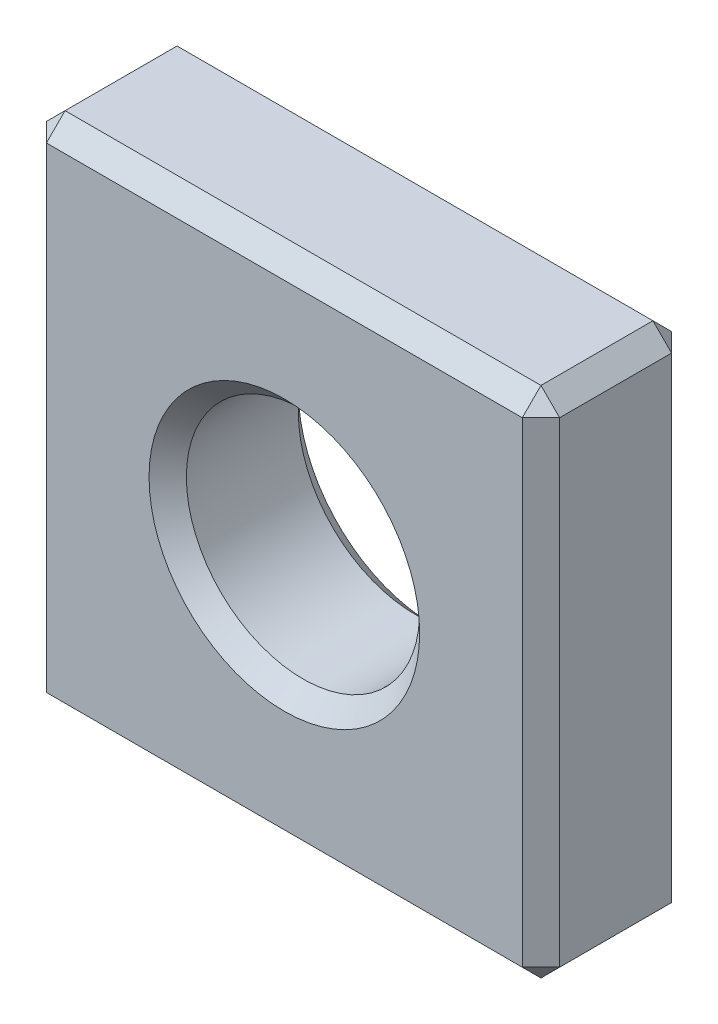
ISO-10303-21;
HEADER;
FILE_DESCRIPTION(('STEP AP214'),'2;1');
FILE_NAME('part.step','',(''),(''),'','','');
FILE_SCHEMA(('AUTOMOTIVE_DESIGN { 1 0 10303 214 1 1 1 1 }'));
ENDSEC;
DATA;
#1=APPLICATION_CONTEXT('core data for automotive mechanical design processes');
#2=APPLICATION_PROTOCOL_DEFINITION('international standard','automotive_design',2000,#1);
#3=PRODUCT_CONTEXT('',#1,'mechanical');
#4=PRODUCT('Part','Part','',(#3));
#5=PRODUCT_RELATED_PRODUCT_CATEGORY('part','',(#4));
#6=PRODUCT_DEFINITION_FORMATION('','',#4);
#7=PRODUCT_DEFINITION_CONTEXT('part definition',#1,'design');
#8=PRODUCT_DEFINITION('design','',#6,#7);
#9=PRODUCT_DEFINITION_SHAPE('','',#8);
#10=(LENGTH_UNIT() NAMED_UNIT(*) SI_UNIT(.MILLI.,.METRE.));
#11=(NAMED_UNIT(*) PLANE_ANGLE_UNIT() SI_UNIT($,.RADIAN.));
#12=(NAMED_UNIT(*) SI_UNIT($,.STERADIAN.) SOLID_ANGLE_UNIT());
#13=UNCERTAINTY_MEASURE_WITH_UNIT(LENGTH_MEASURE(1.E-05),#10,'distance_accuracy_value','');
#14=(GEOMETRIC_REPRESENTATION_CONTEXT(3) GLOBAL_UNCERTAINTY_ASSIGNED_CONTEXT((#13)) GLOBAL_UNIT_ASSIGNED_CONTEXT((#10,
#11,#12)) REPRESENTATION_CONTEXT('',''));
#15=CARTESIAN_POINT('',(0.,0.,0.));
#16=DIRECTION('',(0.,0.,1.));
#17=DIRECTION('',(1.,0.,0.));
#18=AXIS2_PLACEMENT_3D('',#15,#16,#17);
#19=CARTESIAN_POINT('',(0.,0.,1.6));
#20=DIRECTION('',(0.,0.,-1.));
#21=DIRECTION('',(-1.,0.,0.));
#22=AXIS2_PLACEMENT_3D('',#19,#20,#21);
#23=PLANE('',#22);
#24=CARTESIAN_POINT('',(0.,0.,1.6));
#25=DIRECTION('',(0.,0.,-1.));
#26=DIRECTION('',(-1.,0.,0.));
#27=AXIS2_PLACEMENT_3D('',#24,#25,#26);
#28=CIRCLE('',#27,1.45);
#29=CARTESIAN_POINT('',(-1.45,0.,1.6));
#30=VERTEX_POINT('',#29);
#31=EDGE_CURVE('E224',#30,#30,#28,.T.);
#32=ORIENTED_EDGE('',*,*,#31,.T.);
#33=EDGE_LOOP('',(#32));
#34=FACE_BOUND('',#33,.T.);
#35=DIRECTION('',(0.,-1.,0.));
#36=VECTOR('',#35,1.);
#37=CARTESIAN_POINT('',(-2.55,0.,1.6));
#38=LINE('',#37,#36);
#39=CARTESIAN_POINT('',(-2.55,2.55,1.6));
#40=VERTEX_POINT('',#39);
#41=CARTESIAN_POINT('',(-2.55,-2.55,1.6));
#42=VERTEX_POINT('',#41);
#43=EDGE_CURVE('E217',#40,#42,#38,.T.);
#44=ORIENTED_EDGE('',*,*,#43,.T.);
#45=DIRECTION('',(1.,0.,0.));
#46=VECTOR('',#45,1.);
#47=CARTESIAN_POINT('',(0.,-2.55,1.6));
#48=LINE('',#47,#46);
#49=CARTESIAN_POINT('',(2.55,-2.55,1.6));
#50=VERTEX_POINT('',#49);
#51=EDGE_CURVE('E221',#42,#50,#48,.T.);
#52=ORIENTED_EDGE('',*,*,#51,.T.);
#53=DIRECTION('',(0.,1.,0.));
#54=VECTOR('',#53,1.);
#55=CARTESIAN_POINT('',(2.55,0.,1.6));
#56=LINE('',#55,#54);
#57=CARTESIAN_POINT('',(2.55,2.55,1.6));
#58=VERTEX_POINT('',#57);
#59=EDGE_CURVE('E226',#50,#58,#56,.T.);
#60=ORIENTED_EDGE('',*,*,#59,.T.);
#61=DIRECTION('',(-1.,0.,0.));
#62=VECTOR('',#61,1.);
#63=CARTESIAN_POINT('',(0.,2.55,1.6));
#64=LINE('',#63,#62);
#65=EDGE_CURVE('E222',#58,#40,#64,.T.);
#66=ORIENTED_EDGE('',*,*,#65,.T.);
#67=EDGE_LOOP('',(#44,#52,#60,#66));
#68=FACE_BOUND('',#67,.T.);
#69=ADVANCED_FACE('F33',(#34,#68),#23,.F.);
#70=CARTESIAN_POINT('',(0.,0.,0.));
#71=DIRECTION('',(0.,0.,-1.));
#72=DIRECTION('',(-1.,0.,0.));
#73=AXIS2_PLACEMENT_3D('',#70,#71,#72);
#74=PLANE('',#73);
#75=CARTESIAN_POINT('',(0.,0.,0.));
#76=DIRECTION('',(0.,0.,-1.));
#77=DIRECTION('',(-1.,0.,0.));
#78=AXIS2_PLACEMENT_3D('',#75,#76,#77);
#79=CIRCLE('',#78,1.45);
#80=CARTESIAN_POINT('',(-1.45,0.,0.));
#81=VERTEX_POINT('',#80);
#82=EDGE_CURVE('E559',#81,#81,#79,.F.);
#83=ORIENTED_EDGE('',*,*,#82,.T.);
#84=EDGE_LOOP('',(#83));
#85=FACE_BOUND('',#84,.T.);
#86=DIRECTION('',(0.,1.,0.));
#87=VECTOR('',#86,1.);
#88=CARTESIAN_POINT('',(-2.55,2.75,0.));
#89=LINE('',#88,#87);
#90=CARTESIAN_POINT('',(-2.55,-2.55,0.));
#91=VERTEX_POINT('',#90);
#92=CARTESIAN_POINT('',(-2.55,2.55,0.));
#93=VERTEX_POINT('',#92);
#94=EDGE_CURVE('E128',#91,#93,#89,.T.);
#95=ORIENTED_EDGE('',*,*,#94,.T.);
#96=DIRECTION('',(1.,0.,0.));
#97=VECTOR('',#96,1.);
#98=CARTESIAN_POINT('',(2.75,2.55,0.));
#99=LINE('',#98,#97);
#100=CARTESIAN_POINT('',(2.55,2.55,0.));
#101=VERTEX_POINT('',#100);
#102=EDGE_CURVE('E563',#93,#101,#99,.T.);
#103=ORIENTED_EDGE('',*,*,#102,.T.);
#104=DIRECTION('',(0.,-1.,0.));
#105=VECTOR('',#104,1.);
#106=CARTESIAN_POINT('',(2.55,-2.75,0.));
#107=LINE('',#106,#105);
#108=CARTESIAN_POINT('',(2.55,-2.55,0.));
#109=VERTEX_POINT('',#108);
#110=EDGE_CURVE('E130',#101,#109,#107,.T.);
#111=ORIENTED_EDGE('',*,*,#110,.T.);
#112=DIRECTION('',(-1.,0.,0.));
#113=VECTOR('',#112,1.);
#114=CARTESIAN_POINT('',(-2.75,-2.55,0.));
#115=LINE('',#114,#113);
#116=EDGE_CURVE('E124',#109,#91,#115,.T.);
#117=ORIENTED_EDGE('',*,*,#116,.T.);
#118=EDGE_LOOP('',(#95,#103,#111,#117));
#119=FACE_BOUND('',#118,.T.);
#120=ADVANCED_FACE('F126',(#85,#119),#74,.T.);
#121=CARTESIAN_POINT('',(2.75,-2.75,1.6));
#122=DIRECTION('',(-1.,0.,0.));
#123=DIRECTION('',(0.,0.,1.));
#124=AXIS2_PLACEMENT_3D('',#121,#122,#123);
#125=PLANE('',#124);
#126=DIRECTION('',(0.,0.,-1.));
#127=VECTOR('',#126,1.);
#128=CARTESIAN_POINT('',(2.75,-2.55,1.6));
#129=LINE('',#128,#127);
#130=CARTESIAN_POINT('',(2.75,-2.55,1.4));
#131=VERTEX_POINT('',#130);
#132=CARTESIAN_POINT('',(2.75,-2.55,0.200000000000001));
#133=VERTEX_POINT('',#132);
#134=EDGE_CURVE('E236',#131,#133,#129,.T.);
#135=ORIENTED_EDGE('',*,*,#134,.T.);
#136=DIRECTION('',(0.,1.,0.));
#137=VECTOR('',#136,1.);
#138=CARTESIAN_POINT('',(2.75,2.75,0.200000000000001));
#139=LINE('',#138,#137);
#140=CARTESIAN_POINT('',(2.75,2.55,0.200000000000001));
#141=VERTEX_POINT('',#140);
#142=EDGE_CURVE('E239',#133,#141,#139,.T.);
#143=ORIENTED_EDGE('',*,*,#142,.T.);
#144=DIRECTION('',(0.,0.,1.));
#145=VECTOR('',#144,1.);
#146=CARTESIAN_POINT('',(2.75,2.55,1.6));
#147=LINE('',#146,#145);
#148=CARTESIAN_POINT('',(2.75,2.55,1.4));
#149=VERTEX_POINT('',#148);
#150=EDGE_CURVE('E234',#141,#149,#147,.T.);
#151=ORIENTED_EDGE('',*,*,#150,.T.);
#152=DIRECTION('',(0.,-1.,0.));
#153=VECTOR('',#152,1.);
#154=CARTESIAN_POINT('',(2.75,-2.75,1.4));
#155=LINE('',#154,#153);
#156=EDGE_CURVE('E232',#149,#131,#155,.T.);
#157=ORIENTED_EDGE('',*,*,#156,.T.);
#158=EDGE_LOOP('',(#135,#143,#151,#157));
#159=FACE_BOUND('',#158,.T.);
#160=ADVANCED_FACE('F293',(#159),#125,.F.);
#161=CARTESIAN_POINT('',(-2.75,2.75,1.6));
#162=DIRECTION('',(0.,-1.,0.));
#163=DIRECTION('',(0.,0.,-1.));
#164=AXIS2_PLACEMENT_3D('',#161,#162,#163);
#165=PLANE('',#164);
#166=DIRECTION('',(1.,0.,0.));
#167=VECTOR('',#166,1.);
#168=CARTESIAN_POINT('',(-2.75,2.75,1.4));
#169=LINE('',#168,#167);
#170=CARTESIAN_POINT('',(-2.55,2.75,1.4));
#171=VERTEX_POINT('',#170);
#172=CARTESIAN_POINT('',(2.55,2.75,1.4));
#173=VERTEX_POINT('',#172);
#174=EDGE_CURVE('E256',#171,#173,#169,.T.);
#175=ORIENTED_EDGE('',*,*,#174,.T.);
#176=DIRECTION('',(0.,0.,-1.));
#177=VECTOR('',#176,1.);
#178=CARTESIAN_POINT('',(2.55,2.75,1.6));
#179=LINE('',#178,#177);
#180=CARTESIAN_POINT('',(2.55,2.75,0.200000000000001));
#181=VERTEX_POINT('',#180);
#182=EDGE_CURVE('E11',#173,#181,#179,.T.);
#183=ORIENTED_EDGE('',*,*,#182,.T.);
#184=DIRECTION('',(-1.,0.,0.));
#185=VECTOR('',#184,1.);
#186=CARTESIAN_POINT('',(-2.75,2.75,0.200000000000001));
#187=LINE('',#186,#185);
#188=CARTESIAN_POINT('',(-2.55,2.75,0.200000000000001));
#189=VERTEX_POINT('',#188);
#190=EDGE_CURVE('E42',#181,#189,#187,.T.);
#191=ORIENTED_EDGE('',*,*,#190,.T.);
#192=DIRECTION('',(0.,0.,1.));
#193=VECTOR('',#192,1.);
#194=CARTESIAN_POINT('',(-2.55,2.75,1.6));
#195=LINE('',#194,#193);
#196=EDGE_CURVE('E258',#189,#171,#195,.T.);
#197=ORIENTED_EDGE('',*,*,#196,.T.);
#198=EDGE_LOOP('',(#175,#183,#191,#197));
#199=FACE_BOUND('',#198,.T.);
#200=ADVANCED_FACE('F306',(#199),#165,.F.);
#201=CARTESIAN_POINT('',(-2.75,-2.75,1.6));
#202=DIRECTION('',(1.,0.,0.));
#203=DIRECTION('',(0.,0.,-1.));
#204=AXIS2_PLACEMENT_3D('',#201,#202,#203);
#205=PLANE('',#204);
#206=DIRECTION('',(0.,-1.,0.));
#207=VECTOR('',#206,1.);
#208=CARTESIAN_POINT('',(-2.75,-2.75,0.200000000000001));
#209=LINE('',#208,#207);
#210=CARTESIAN_POINT('',(-2.75,2.55,0.200000000000001));
#211=VERTEX_POINT('',#210);
#212=CARTESIAN_POINT('',(-2.75,-2.55,0.200000000000001));
#213=VERTEX_POINT('',#212);
#214=EDGE_CURVE('E252',#211,#213,#209,.T.);
#215=ORIENTED_EDGE('',*,*,#214,.T.);
#216=DIRECTION('',(0.,0.,1.));
#217=VECTOR('',#216,1.);
#218=CARTESIAN_POINT('',(-2.75,-2.55,1.6));
#219=LINE('',#218,#217);
#220=CARTESIAN_POINT('',(-2.75,-2.55,1.4));
#221=VERTEX_POINT('',#220);
#222=EDGE_CURVE('E254',#213,#221,#219,.T.);
#223=ORIENTED_EDGE('',*,*,#222,.T.);
#224=DIRECTION('',(0.,1.,0.));
#225=VECTOR('',#224,1.);
#226=CARTESIAN_POINT('',(-2.75,-2.75,1.4));
#227=LINE('',#226,#225);
#228=CARTESIAN_POINT('',(-2.75,2.55,1.4));
#229=VERTEX_POINT('',#228);
#230=EDGE_CURVE('E215',#221,#229,#227,.T.);
#231=ORIENTED_EDGE('',*,*,#230,.T.);
#232=DIRECTION('',(0.,0.,-1.));
#233=VECTOR('',#232,1.);
#234=CARTESIAN_POINT('',(-2.75,2.55,1.6));
#235=LINE('',#234,#233);
#236=EDGE_CURVE('E250',#229,#211,#235,.T.);
#237=ORIENTED_EDGE('',*,*,#236,.T.);
#238=EDGE_LOOP('',(#215,#223,#231,#237));
#239=FACE_BOUND('',#238,.T.);
#240=ADVANCED_FACE('F302',(#239),#205,.F.);
#241=CARTESIAN_POINT('',(-2.75,-2.75,1.6));
#242=DIRECTION('',(0.,1.,0.));
#243=DIRECTION('',(0.,0.,1.));
#244=AXIS2_PLACEMENT_3D('',#241,#242,#243);
#245=PLANE('',#244);
#246=DIRECTION('',(0.,0.,-1.));
#247=VECTOR('',#246,1.);
#248=CARTESIAN_POINT('',(-2.55,-2.75,1.6));
#249=LINE('',#248,#247);
#250=CARTESIAN_POINT('',(-2.55,-2.75,1.4));
#251=VERTEX_POINT('',#250);
#252=CARTESIAN_POINT('',(-2.55,-2.75,0.200000000000001));
#253=VERTEX_POINT('',#252);
#254=EDGE_CURVE('E243',#251,#253,#249,.T.);
#255=ORIENTED_EDGE('',*,*,#254,.T.);
#256=DIRECTION('',(1.,0.,0.));
#257=VECTOR('',#256,1.);
#258=CARTESIAN_POINT('',(2.75,-2.75,0.200000000000001));
#259=LINE('',#258,#257);
#260=CARTESIAN_POINT('',(2.55,-2.75,0.200000000000001));
#261=VERTEX_POINT('',#260);
#262=EDGE_CURVE('E156',#253,#261,#259,.T.);
#263=ORIENTED_EDGE('',*,*,#262,.T.);
#264=DIRECTION('',(0.,0.,1.));
#265=VECTOR('',#264,1.);
#266=CARTESIAN_POINT('',(2.55,-2.75,1.6));
#267=LINE('',#266,#265);
#268=CARTESIAN_POINT('',(2.55,-2.75,1.4));
#269=VERTEX_POINT('',#268);
#270=EDGE_CURVE('E245',#261,#269,#267,.T.);
#271=ORIENTED_EDGE('',*,*,#270,.T.);
#272=DIRECTION('',(-1.,0.,0.));
#273=VECTOR('',#272,1.);
#274=CARTESIAN_POINT('',(-2.75,-2.75,1.4));
#275=LINE('',#274,#273);
#276=EDGE_CURVE('E241',#269,#251,#275,.T.);
#277=ORIENTED_EDGE('',*,*,#276,.T.);
#278=EDGE_LOOP('',(#255,#263,#271,#277));
#279=FACE_BOUND('',#278,.T.);
#280=ADVANCED_FACE('F299',(#279),#245,.F.);
#281=CARTESIAN_POINT('',(0.,0.,1.6));
#282=DIRECTION('',(0.,0.,-1.));
#283=DIRECTION('',(-1.,0.,0.));
#284=AXIS2_PLACEMENT_3D('',#281,#282,#283);
#285=CYLINDRICAL_SURFACE('',#284,1.25);
#286=CARTESIAN_POINT('',(0.,0.,0.2));
#287=DIRECTION('',(0.,0.,-1.));
#288=DIRECTION('',(-1.,0.,0.));
#289=AXIS2_PLACEMENT_3D('',#286,#287,#288);
#290=CIRCLE('',#289,1.25);
#291=CARTESIAN_POINT('',(-1.25,0.,0.2));
#292=VERTEX_POINT('',#291);
#293=EDGE_CURVE('E286',#292,#292,#290,.T.);
#294=ORIENTED_EDGE('',*,*,#293,.T.);
#295=EDGE_LOOP('',(#294));
#296=FACE_BOUND('',#295,.T.);
#297=CARTESIAN_POINT('',(0.,0.,1.4));
#298=DIRECTION('',(0.,0.,-1.));
#299=DIRECTION('',(-1.,0.,0.));
#300=AXIS2_PLACEMENT_3D('',#297,#298,#299);
#301=CIRCLE('',#300,1.25);
#302=CARTESIAN_POINT('',(-1.25,0.,1.4));
#303=VERTEX_POINT('',#302);
#304=EDGE_CURVE('E557',#303,#303,#301,.F.);
#305=ORIENTED_EDGE('',*,*,#304,.T.);
#306=EDGE_LOOP('',(#305));
#307=FACE_BOUND('',#306,.T.);
#308=ADVANCED_FACE('F297',(#296,#307),#285,.F.);
#309=CARTESIAN_POINT('',(0.,0.,0.));
#310=DIRECTION('',(0.,0.,-1.));
#311=DIRECTION('',(-1.,0.,0.));
#312=AXIS2_PLACEMENT_3D('',#309,#310,#311);
#313=CONICAL_SURFACE('',#312,1.45,0.785398163397447);
#314=ORIENTED_EDGE('',*,*,#293,.F.);
#315=EDGE_LOOP('',(#314));
#316=FACE_BOUND('',#315,.T.);
#317=ORIENTED_EDGE('',*,*,#82,.F.);
#318=EDGE_LOOP('',(#317));
#319=FACE_BOUND('',#318,.T.);
#320=ADVANCED_FACE('F313',(#316,#319),#313,.F.);
#321=CARTESIAN_POINT('',(0.,0.,1.4));
#322=DIRECTION('',(0.,0.,1.));
#323=DIRECTION('',(1.,0.,0.));
#324=AXIS2_PLACEMENT_3D('',#321,#322,#323);
#325=CONICAL_SURFACE('',#324,1.25,0.785398163397452);
#326=ORIENTED_EDGE('',*,*,#31,.F.);
#327=EDGE_LOOP('',(#326));
#328=FACE_BOUND('',#327,.T.);
#329=ORIENTED_EDGE('',*,*,#304,.F.);
#330=EDGE_LOOP('',(#329));
#331=FACE_BOUND('',#330,.T.);
#332=ADVANCED_FACE('F316',(#328,#331),#325,.F.);
#333=CARTESIAN_POINT('',(-2.75,2.55,1.6));
#334=DIRECTION('',(0.707106781186547,-0.707106781186547,0.));
#335=DIRECTION('',(0.,0.,-1.));
#336=AXIS2_PLACEMENT_3D('',#333,#334,#335);
#337=PLANE('',#336);
#338=DIRECTION('',(0.707106781186547,0.707106781186547,0.));
#339=VECTOR('',#338,1.);
#340=CARTESIAN_POINT('',(-2.55,2.75,1.4));
#341=LINE('',#340,#339);
#342=EDGE_CURVE('E37',#171,#229,#341,.F.);
#343=ORIENTED_EDGE('',*,*,#342,.F.);
#344=ORIENTED_EDGE('',*,*,#196,.F.);
#345=DIRECTION('',(-0.707106781186547,-0.707106781186547,0.));
#346=VECTOR('',#345,1.);
#347=CARTESIAN_POINT('',(-2.55,2.75,0.200000000000001));
#348=LINE('',#347,#346);
#349=EDGE_CURVE('E197',#211,#189,#348,.F.);
#350=ORIENTED_EDGE('',*,*,#349,.F.);
#351=ORIENTED_EDGE('',*,*,#236,.F.);
#352=EDGE_LOOP('',(#343,#344,#350,#351));
#353=FACE_BOUND('',#352,.T.);
#354=ADVANCED_FACE('F35',(#353),#337,.F.);
#355=CARTESIAN_POINT('',(-2.55,2.75,1.4));
#356=DIRECTION('',(-0.577350269189626,0.577350269189626,0.577350269189626));
#357=DIRECTION('',(0.707106781186547,0.,0.707106781186547));
#358=AXIS2_PLACEMENT_3D('',#355,#356,#357);
#359=PLANE('',#358);
#360=DIRECTION('',(0.,-0.707106781186547,0.707106781186547));
#361=VECTOR('',#360,1.);
#362=CARTESIAN_POINT('',(-2.55,2.75,1.4));
#363=LINE('',#362,#361);
#364=EDGE_CURVE('E192',#171,#40,#363,.T.);
#365=ORIENTED_EDGE('',*,*,#364,.F.);
#366=ORIENTED_EDGE('',*,*,#342,.T.);
#367=DIRECTION('',(-0.707106781186547,0.,-0.707106781186547));
#368=VECTOR('',#367,1.);
#369=CARTESIAN_POINT('',(-2.65,2.55,1.5));
#370=LINE('',#369,#368);
#371=EDGE_CURVE('E195',#40,#229,#370,.T.);
#372=ORIENTED_EDGE('',*,*,#371,.F.);
#373=EDGE_LOOP('',(#365,#366,#372));
#374=FACE_BOUND('',#373,.T.);
#375=ADVANCED_FACE('F206',(#374),#359,.T.);
#376=CARTESIAN_POINT('',(-2.55,2.75,0.200000000000001));
#377=DIRECTION('',(-0.577350269189626,0.577350269189626,-0.577350269189626));
#378=DIRECTION('',(-0.707106781186547,0.,0.707106781186547));
#379=AXIS2_PLACEMENT_3D('',#376,#377,#378);
#380=PLANE('',#379);
#381=DIRECTION('',(-0.707106781186547,0.,0.707106781186547));
#382=VECTOR('',#381,1.);
#383=CARTESIAN_POINT('',(-2.65,2.55,0.1));
#384=LINE('',#383,#382);
#385=EDGE_CURVE('E144',#211,#93,#384,.F.);
#386=ORIENTED_EDGE('',*,*,#385,.F.);
#387=ORIENTED_EDGE('',*,*,#349,.T.);
#388=DIRECTION('',(0.,-0.707106781186547,-0.707106781186547));
#389=VECTOR('',#388,1.);
#390=CARTESIAN_POINT('',(-2.55,2.75,0.200000000000001));
#391=LINE('',#390,#389);
#392=EDGE_CURVE('E189',#93,#189,#391,.F.);
#393=ORIENTED_EDGE('',*,*,#392,.F.);
#394=EDGE_LOOP('',(#386,#387,#393));
#395=FACE_BOUND('',#394,.T.);
#396=ADVANCED_FACE('F374',(#395),#380,.T.);
#397=CARTESIAN_POINT('',(-2.55,0.,1.6));
#398=DIRECTION('',(0.707106781186547,0.,-0.707106781186547));
#399=DIRECTION('',(0.,-1.,0.));
#400=AXIS2_PLACEMENT_3D('',#397,#398,#399);
#401=PLANE('',#400);
#402=ORIENTED_EDGE('',*,*,#371,.T.);
#403=ORIENTED_EDGE('',*,*,#230,.F.);
#404=DIRECTION('',(0.707106781186547,0.,0.707106781186547));
#405=VECTOR('',#404,1.);
#406=CARTESIAN_POINT('',(-2.75,-2.55,1.4));
#407=LINE('',#406,#405);
#408=EDGE_CURVE('E183',#42,#221,#407,.F.);
#409=ORIENTED_EDGE('',*,*,#408,.F.);
#410=ORIENTED_EDGE('',*,*,#43,.F.);
#411=EDGE_LOOP('',(#402,#403,#409,#410));
#412=FACE_BOUND('',#411,.T.);
#413=ADVANCED_FACE('F213',(#412),#401,.F.);
#414=CARTESIAN_POINT('',(0.,2.55,1.6));
#415=DIRECTION('',(0.,-0.707106781186547,-0.707106781186547));
#416=DIRECTION('',(-1.,0.,0.));
#417=AXIS2_PLACEMENT_3D('',#414,#415,#416);
#418=PLANE('',#417);
#419=ORIENTED_EDGE('',*,*,#364,.T.);
#420=ORIENTED_EDGE('',*,*,#65,.F.);
#421=DIRECTION('',(0.,0.707106781186547,-0.707106781186547));
#422=VECTOR('',#421,1.);
#423=CARTESIAN_POINT('',(2.55,2.65,1.5));
#424=LINE('',#423,#422);
#425=EDGE_CURVE('E180',#173,#58,#424,.F.);
#426=ORIENTED_EDGE('',*,*,#425,.F.);
#427=ORIENTED_EDGE('',*,*,#174,.F.);
#428=EDGE_LOOP('',(#419,#420,#426,#427));
#429=FACE_BOUND('',#428,.T.);
#430=ADVANCED_FACE('F367',(#429),#418,.F.);
#431=CARTESIAN_POINT('',(2.55,2.75,1.6));
#432=DIRECTION('',(-0.707106781186547,-0.707106781186547,0.));
#433=DIRECTION('',(0.,0.,-1.));
#434=AXIS2_PLACEMENT_3D('',#431,#432,#433);
#435=PLANE('',#434);
#436=DIRECTION('',(-0.707106781186547,0.707106781186547,0.));
#437=VECTOR('',#436,1.);
#438=CARTESIAN_POINT('',(2.55,2.75,0.200000000000001));
#439=LINE('',#438,#437);
#440=EDGE_CURVE('E175',#181,#141,#439,.F.);
#441=ORIENTED_EDGE('',*,*,#440,.F.);
#442=ORIENTED_EDGE('',*,*,#182,.F.);
#443=DIRECTION('',(0.707106781186547,-0.707106781186547,0.));
#444=VECTOR('',#443,1.);
#445=CARTESIAN_POINT('',(2.75,2.55,1.4));
#446=LINE('',#445,#444);
#447=EDGE_CURVE('E177',#149,#173,#446,.F.);
#448=ORIENTED_EDGE('',*,*,#447,.F.);
#449=ORIENTED_EDGE('',*,*,#150,.F.);
#450=EDGE_LOOP('',(#441,#442,#448,#449));
#451=FACE_BOUND('',#450,.T.);
#452=ADVANCED_FACE('F363',(#451),#435,.F.);
#453=CARTESIAN_POINT('',(-2.75,2.75,0.200000000000001));
#454=DIRECTION('',(0.,0.707106781186547,-0.707106781186547));
#455=DIRECTION('',(1.,0.,0.));
#456=AXIS2_PLACEMENT_3D('',#453,#454,#455);
#457=PLANE('',#456);
#458=ORIENTED_EDGE('',*,*,#392,.T.);
#459=ORIENTED_EDGE('',*,*,#190,.F.);
#460=DIRECTION('',(0.,0.707106781186547,0.707106781186547));
#461=VECTOR('',#460,1.);
#462=CARTESIAN_POINT('',(2.55,2.75,0.200000000000001));
#463=LINE('',#462,#461);
#464=EDGE_CURVE('E50',#101,#181,#463,.T.);
#465=ORIENTED_EDGE('',*,*,#464,.F.);
#466=ORIENTED_EDGE('',*,*,#102,.F.);
#467=EDGE_LOOP('',(#458,#459,#465,#466));
#468=FACE_BOUND('',#467,.T.);
#469=ADVANCED_FACE('F360',(#468),#457,.T.);
#470=CARTESIAN_POINT('',(-2.75,-2.75,0.200000000000001));
#471=DIRECTION('',(-0.707106781186547,0.,-0.707106781186547));
#472=DIRECTION('',(0.,1.,0.));
#473=AXIS2_PLACEMENT_3D('',#470,#471,#472);
#474=PLANE('',#473);
#475=ORIENTED_EDGE('',*,*,#385,.T.);
#476=ORIENTED_EDGE('',*,*,#94,.F.);
#477=DIRECTION('',(0.707106781186547,0.,-0.707106781186547));
#478=VECTOR('',#477,1.);
#479=CARTESIAN_POINT('',(-2.65,-2.55,0.1));
#480=LINE('',#479,#478);
#481=EDGE_CURVE('E141',#213,#91,#480,.T.);
#482=ORIENTED_EDGE('',*,*,#481,.F.);
#483=ORIENTED_EDGE('',*,*,#214,.F.);
#484=EDGE_LOOP('',(#475,#476,#482,#483));
#485=FACE_BOUND('',#484,.T.);
#486=ADVANCED_FACE('F139',(#485),#474,.T.);
#487=CARTESIAN_POINT('',(-2.55,-2.75,1.6));
#488=DIRECTION('',(0.707106781186547,0.707106781186547,0.));
#489=DIRECTION('',(0.,0.,-1.));
#490=AXIS2_PLACEMENT_3D('',#487,#488,#489);
#491=PLANE('',#490);
#492=DIRECTION('',(-0.707106781186547,0.707106781186547,0.));
#493=VECTOR('',#492,1.);
#494=CARTESIAN_POINT('',(-2.75,-2.55,1.4));
#495=LINE('',#494,#493);
#496=EDGE_CURVE('E185',#221,#251,#495,.F.);
#497=ORIENTED_EDGE('',*,*,#496,.F.);
#498=ORIENTED_EDGE('',*,*,#222,.F.);
#499=DIRECTION('',(0.707106781186547,-0.707106781186547,0.));
#500=VECTOR('',#499,1.);
#501=CARTESIAN_POINT('',(-2.55,-2.75,0.200000000000001));
#502=LINE('',#501,#500);
#503=EDGE_CURVE('E153',#253,#213,#502,.F.);
#504=ORIENTED_EDGE('',*,*,#503,.F.);
#505=ORIENTED_EDGE('',*,*,#254,.F.);
#506=EDGE_LOOP('',(#497,#498,#504,#505));
#507=FACE_BOUND('',#506,.T.);
#508=ADVANCED_FACE('F353',(#507),#491,.F.);
#509=CARTESIAN_POINT('',(-2.75,-2.55,1.4));
#510=DIRECTION('',(-0.577350269189626,-0.577350269189626,0.577350269189626));
#511=DIRECTION('',(0.707106781186547,0.,0.707106781186547));
#512=AXIS2_PLACEMENT_3D('',#509,#510,#511);
#513=PLANE('',#512);
#514=ORIENTED_EDGE('',*,*,#408,.T.);
#515=ORIENTED_EDGE('',*,*,#496,.T.);
#516=DIRECTION('',(0.,-0.707106781186547,-0.707106781186547));
#517=VECTOR('',#516,1.);
#518=CARTESIAN_POINT('',(-2.55,-2.65,1.5));
#519=LINE('',#518,#517);
#520=EDGE_CURVE('E170',#42,#251,#519,.T.);
#521=ORIENTED_EDGE('',*,*,#520,.F.);
#522=EDGE_LOOP('',(#514,#515,#521));
#523=FACE_BOUND('',#522,.T.);
#524=ADVANCED_FACE('F349',(#523),#513,.T.);
#525=CARTESIAN_POINT('',(2.75,2.55,1.4));
#526=DIRECTION('',(0.577350269189626,0.577350269189626,0.577350269189626));
#527=DIRECTION('',(0.707106781186547,0.,-0.707106781186547));
#528=AXIS2_PLACEMENT_3D('',#525,#526,#527);
#529=PLANE('',#528);
#530=ORIENTED_EDGE('',*,*,#447,.T.);
#531=ORIENTED_EDGE('',*,*,#425,.T.);
#532=DIRECTION('',(-0.707106781186547,0.,0.707106781186547));
#533=VECTOR('',#532,1.);
#534=CARTESIAN_POINT('',(2.75,2.55,1.4));
#535=LINE('',#534,#533);
#536=EDGE_CURVE('E161',#149,#58,#535,.T.);
#537=ORIENTED_EDGE('',*,*,#536,.F.);
#538=EDGE_LOOP('',(#530,#531,#537));
#539=FACE_BOUND('',#538,.T.);
#540=ADVANCED_FACE('F346',(#539),#529,.T.);
#541=CARTESIAN_POINT('',(2.55,2.75,0.200000000000001));
#542=DIRECTION('',(0.577350269189626,0.577350269189626,-0.577350269189626));
#543=DIRECTION('',(-0.707106781186547,0.,-0.707106781186547));
#544=AXIS2_PLACEMENT_3D('',#541,#542,#543);
#545=PLANE('',#544);
#546=ORIENTED_EDGE('',*,*,#464,.T.);
#547=ORIENTED_EDGE('',*,*,#440,.T.);
#548=DIRECTION('',(-0.707106781186547,0.,-0.707106781186547));
#549=VECTOR('',#548,1.);
#550=CARTESIAN_POINT('',(2.65,2.55,0.1));
#551=LINE('',#550,#549);
#552=EDGE_CURVE('E157',#101,#141,#551,.F.);
#553=ORIENTED_EDGE('',*,*,#552,.F.);
#554=EDGE_LOOP('',(#546,#547,#553));
#555=FACE_BOUND('',#554,.T.);
#556=ADVANCED_FACE('F343',(#555),#545,.T.);
#557=CARTESIAN_POINT('',(-2.55,-2.75,0.200000000000001));
#558=DIRECTION('',(-0.577350269189626,-0.577350269189626,-0.577350269189626));
#559=DIRECTION('',(-0.707106781186547,0.,0.707106781186547));
#560=AXIS2_PLACEMENT_3D('',#557,#558,#559);
#561=PLANE('',#560);
#562=ORIENTED_EDGE('',*,*,#503,.T.);
#563=ORIENTED_EDGE('',*,*,#481,.T.);
#564=DIRECTION('',(0.,-0.707106781186547,0.707106781186547));
#565=VECTOR('',#564,1.);
#566=CARTESIAN_POINT('',(-2.55,-2.75,0.200000000000001));
#567=LINE('',#566,#565);
#568=EDGE_CURVE('E150',#253,#91,#567,.F.);
#569=ORIENTED_EDGE('',*,*,#568,.F.);
#570=EDGE_LOOP('',(#562,#563,#569));
#571=FACE_BOUND('',#570,.T.);
#572=ADVANCED_FACE('F149',(#571),#561,.T.);
#573=CARTESIAN_POINT('',(0.,-2.55,1.6));
#574=DIRECTION('',(0.,0.707106781186547,-0.707106781186547));
#575=DIRECTION('',(1.,0.,0.));
#576=AXIS2_PLACEMENT_3D('',#573,#574,#575);
#577=PLANE('',#576);
#578=ORIENTED_EDGE('',*,*,#520,.T.);
#579=ORIENTED_EDGE('',*,*,#276,.F.);
#580=DIRECTION('',(0.,0.707106781186547,0.707106781186547));
#581=VECTOR('',#580,1.);
#582=CARTESIAN_POINT('',(2.55,-2.75,1.4));
#583=LINE('',#582,#581);
#584=EDGE_CURVE('E158',#50,#269,#583,.F.);
#585=ORIENTED_EDGE('',*,*,#584,.F.);
#586=ORIENTED_EDGE('',*,*,#51,.F.);
#587=EDGE_LOOP('',(#578,#579,#585,#586));
#588=FACE_BOUND('',#587,.T.);
#589=ADVANCED_FACE('F282',(#588),#577,.F.);
#590=CARTESIAN_POINT('',(2.55,0.,1.6));
#591=DIRECTION('',(-0.707106781186547,0.,-0.707106781186547));
#592=DIRECTION('',(0.,1.,0.));
#593=AXIS2_PLACEMENT_3D('',#590,#591,#592);
#594=PLANE('',#593);
#595=ORIENTED_EDGE('',*,*,#536,.T.);
#596=ORIENTED_EDGE('',*,*,#59,.F.);
#597=DIRECTION('',(0.707106781186547,0.,-0.707106781186547));
#598=VECTOR('',#597,1.);
#599=CARTESIAN_POINT('',(2.65,-2.55,1.5));
#600=LINE('',#599,#598);
#601=EDGE_CURVE('E164',#131,#50,#600,.F.);
#602=ORIENTED_EDGE('',*,*,#601,.F.);
#603=ORIENTED_EDGE('',*,*,#156,.F.);
#604=EDGE_LOOP('',(#595,#596,#602,#603));
#605=FACE_BOUND('',#604,.T.);
#606=ADVANCED_FACE('F283',(#605),#594,.F.);
#607=CARTESIAN_POINT('',(2.75,-2.75,0.200000000000001));
#608=DIRECTION('',(0.707106781186547,0.,-0.707106781186547));
#609=DIRECTION('',(0.,-1.,0.));
#610=AXIS2_PLACEMENT_3D('',#607,#608,#609);
#611=PLANE('',#610);
#612=ORIENTED_EDGE('',*,*,#552,.T.);
#613=ORIENTED_EDGE('',*,*,#142,.F.);
#614=DIRECTION('',(0.707106781186547,0.,0.707106781186547));
#615=VECTOR('',#614,1.);
#616=CARTESIAN_POINT('',(2.75,-2.55,0.200000000000001));
#617=LINE('',#616,#615);
#618=EDGE_CURVE('E268',#109,#133,#617,.T.);
#619=ORIENTED_EDGE('',*,*,#618,.F.);
#620=ORIENTED_EDGE('',*,*,#110,.F.);
#621=EDGE_LOOP('',(#612,#613,#619,#620));
#622=FACE_BOUND('',#621,.T.);
#623=ADVANCED_FACE('F333',(#622),#611,.T.);
#624=CARTESIAN_POINT('',(-2.75,-2.75,0.200000000000001));
#625=DIRECTION('',(0.,-0.707106781186547,-0.707106781186547));
#626=DIRECTION('',(-1.,0.,0.));
#627=AXIS2_PLACEMENT_3D('',#624,#625,#626);
#628=PLANE('',#627);
#629=ORIENTED_EDGE('',*,*,#568,.T.);
#630=ORIENTED_EDGE('',*,*,#116,.F.);
#631=DIRECTION('',(0.,0.707106781186547,-0.707106781186547));
#632=VECTOR('',#631,1.);
#633=CARTESIAN_POINT('',(2.55,-2.65,0.1));
#634=LINE('',#633,#632);
#635=EDGE_CURVE('E265',#261,#109,#634,.T.);
#636=ORIENTED_EDGE('',*,*,#635,.F.);
#637=ORIENTED_EDGE('',*,*,#262,.F.);
#638=EDGE_LOOP('',(#629,#630,#636,#637));
#639=FACE_BOUND('',#638,.T.);
#640=ADVANCED_FACE('F155',(#639),#628,.T.);
#641=CARTESIAN_POINT('',(2.55,-2.75,1.4));
#642=DIRECTION('',(0.577350269189626,-0.577350269189626,0.577350269189626));
#643=DIRECTION('',(0.707106781186547,0.,-0.707106781186547));
#644=AXIS2_PLACEMENT_3D('',#641,#642,#643);
#645=PLANE('',#644);
#646=ORIENTED_EDGE('',*,*,#601,.T.);
#647=ORIENTED_EDGE('',*,*,#584,.T.);
#648=DIRECTION('',(-0.707106781186547,-0.707106781186547,0.));
#649=VECTOR('',#648,1.);
#650=CARTESIAN_POINT('',(2.55,-2.75,1.4));
#651=LINE('',#650,#649);
#652=EDGE_CURVE('E263',#131,#269,#651,.T.);
#653=ORIENTED_EDGE('',*,*,#652,.F.);
#654=EDGE_LOOP('',(#646,#647,#653));
#655=FACE_BOUND('',#654,.T.);
#656=ADVANCED_FACE('F274',(#655),#645,.T.);
#657=CARTESIAN_POINT('',(2.75,-2.55,0.200000000000001));
#658=DIRECTION('',(0.577350269189626,-0.577350269189626,-0.577350269189626));
#659=DIRECTION('',(-0.707106781186547,0.,-0.707106781186547));
#660=AXIS2_PLACEMENT_3D('',#657,#658,#659);
#661=PLANE('',#660);
#662=ORIENTED_EDGE('',*,*,#635,.T.);
#663=ORIENTED_EDGE('',*,*,#618,.T.);
#664=DIRECTION('',(0.707106781186547,0.707106781186547,0.));
#665=VECTOR('',#664,1.);
#666=CARTESIAN_POINT('',(2.75,-2.55,0.200000000000001));
#667=LINE('',#666,#665);
#668=EDGE_CURVE('E261',#261,#133,#667,.T.);
#669=ORIENTED_EDGE('',*,*,#668,.F.);
#670=EDGE_LOOP('',(#662,#663,#669));
#671=FACE_BOUND('',#670,.T.);
#672=ADVANCED_FACE('F324',(#671),#661,.T.);
#673=CARTESIAN_POINT('',(2.75,-2.55,1.6));
#674=DIRECTION('',(-0.707106781186547,0.707106781186547,0.));
#675=DIRECTION('',(0.,0.,-1.));
#676=AXIS2_PLACEMENT_3D('',#673,#674,#675);
#677=PLANE('',#676);
#678=ORIENTED_EDGE('',*,*,#652,.T.);
#679=ORIENTED_EDGE('',*,*,#270,.F.);
#680=ORIENTED_EDGE('',*,*,#668,.T.);
#681=ORIENTED_EDGE('',*,*,#134,.F.);
#682=EDGE_LOOP('',(#678,#679,#680,#681));
#683=FACE_BOUND('',#682,.T.);
#684=ADVANCED_FACE('F321',(#683),#677,.F.);
#685=CLOSED_SHELL('',(#69,#120,#160,#200,#240,#280,#308,#320,#332,#354,#375,#396,#413,#430,#452,
#469,#486,#508,#524,#540,#556,#572,#589,#606,#623,#640,#656,#672,#684));
#686=MANIFOLD_SOLID_BREP('B2',#685);
#687=ADVANCED_BREP_SHAPE_REPRESENTATION('',(#18,#686),#14);
#688=SHAPE_DEFINITION_REPRESENTATION(#9,#687);
ENDSEC;
END-ISO-10303-21;
